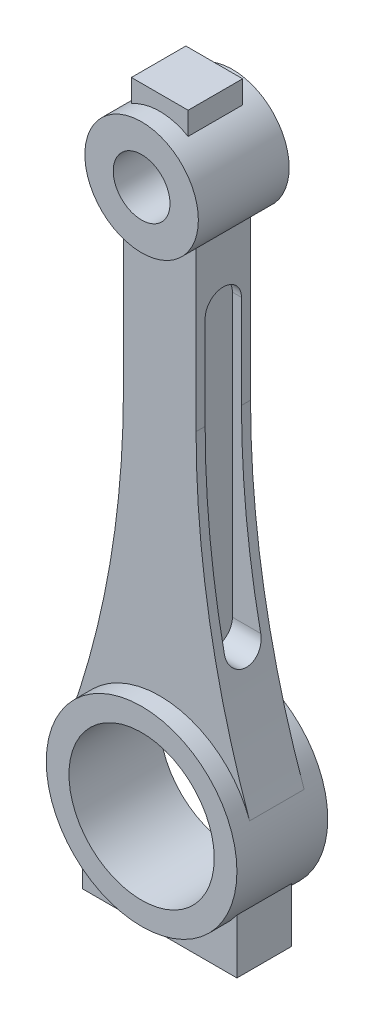
ISO-10303-21;
HEADER;
FILE_DESCRIPTION(('STEP AP214'),'2;1');
FILE_NAME('part.step','',(''),(''),'','','');
FILE_SCHEMA(('AUTOMOTIVE_DESIGN { 1 0 10303 214 1 1 1 1 }'));
ENDSEC;
DATA;
#1=APPLICATION_CONTEXT('core data for automotive mechanical design processes');
#2=APPLICATION_PROTOCOL_DEFINITION('international standard','automotive_design',2000,#1);
#3=PRODUCT_CONTEXT('',#1,'mechanical');
#4=PRODUCT('Part','Part','',(#3));
#5=PRODUCT_RELATED_PRODUCT_CATEGORY('part','',(#4));
#6=PRODUCT_DEFINITION_FORMATION('','',#4);
#7=PRODUCT_DEFINITION_CONTEXT('part definition',#1,'design');
#8=PRODUCT_DEFINITION('design','',#6,#7);
#9=PRODUCT_DEFINITION_SHAPE('','',#8);
#10=(LENGTH_UNIT() NAMED_UNIT(*) SI_UNIT(.MILLI.,.METRE.));
#11=(NAMED_UNIT(*) PLANE_ANGLE_UNIT() SI_UNIT($,.RADIAN.));
#12=(NAMED_UNIT(*) SI_UNIT($,.STERADIAN.) SOLID_ANGLE_UNIT());
#13=UNCERTAINTY_MEASURE_WITH_UNIT(LENGTH_MEASURE(1.E-05),#10,'distance_accuracy_value','');
#14=(GEOMETRIC_REPRESENTATION_CONTEXT(3) GLOBAL_UNCERTAINTY_ASSIGNED_CONTEXT((#13)) GLOBAL_UNIT_ASSIGNED_CONTEXT((#10,
#11,#12)) REPRESENTATION_CONTEXT('',''));
#15=CARTESIAN_POINT('',(0.,0.,0.));
#16=DIRECTION('',(0.,0.,1.));
#17=DIRECTION('',(1.,0.,0.));
#18=AXIS2_PLACEMENT_3D('',#15,#16,#17);
#19=CARTESIAN_POINT('',(212.132819979024,75.3953136438507,6.));
#20=DIRECTION('',(0.,0.,-1.));
#21=DIRECTION('',(-1.,0.,0.));
#22=AXIS2_PLACEMENT_3D('',#19,#20,#21);
#23=CYLINDRICAL_SURFACE('',#22,204.132819979024);
#24=CARTESIAN_POINT('',(212.132819979024,75.3953136438507,4.));
#25=DIRECTION('',(0.,0.,-1.));
#26=DIRECTION('',(0.,1.,0.));
#27=AXIS2_PLACEMENT_3D('',#24,#25,#26);
#28=CIRCLE('',#27,204.132819979024);
#29=CARTESIAN_POINT('',(7.99999999999999,75.3953136438507,4.));
#30=VERTEX_POINT('',#29);
#31=CARTESIAN_POINT('',(12.2412588742194,34.,3.99999999999999));
#32=VERTEX_POINT('',#31);
#33=EDGE_CURVE('E256',#30,#32,#28,.F.);
#34=ORIENTED_EDGE('',*,*,#33,.F.);
#35=DIRECTION('',(0.,0.,-1.));
#36=VECTOR('',#35,1.);
#37=CARTESIAN_POINT('',(7.99999999999999,75.3953136438507,6.));
#38=LINE('',#37,#36);
#39=CARTESIAN_POINT('',(7.99999999999999,75.3953136438507,6.));
#40=VERTEX_POINT('',#39);
#41=EDGE_CURVE('E380',#40,#30,#38,.T.);
#42=ORIENTED_EDGE('',*,*,#41,.F.);
#43=CARTESIAN_POINT('',(212.132819979024,75.3953136438507,6.));
#44=DIRECTION('',(0.,0.,-1.));
#45=DIRECTION('',(1.,0.,0.));
#46=AXIS2_PLACEMENT_3D('',#43,#44,#45);
#47=CIRCLE('',#46,204.132819979024);
#48=CARTESIAN_POINT('',(19.7873824881444,7.03274443356763,6.));
#49=VERTEX_POINT('',#48);
#50=EDGE_CURVE('E334',#49,#40,#47,.T.);
#51=ORIENTED_EDGE('',*,*,#50,.F.);
#52=DIRECTION('',(0.,0.,-1.));
#53=VECTOR('',#52,1.);
#54=CARTESIAN_POINT('',(19.7873824881444,7.03274443356764,6.));
#55=LINE('',#54,#53);
#56=CARTESIAN_POINT('',(19.7873824881444,7.03274443356764,-6.));
#57=VERTEX_POINT('',#56);
#58=EDGE_CURVE('E350',#49,#57,#55,.T.);
#59=ORIENTED_EDGE('',*,*,#58,.T.);
#60=CARTESIAN_POINT('',(212.132819979024,75.3953136438507,-6.));
#61=DIRECTION('',(0.,0.,-1.));
#62=DIRECTION('',(1.,0.,0.));
#63=AXIS2_PLACEMENT_3D('',#60,#61,#62);
#64=CIRCLE('',#63,204.132819979024);
#65=CARTESIAN_POINT('',(7.99999999999999,75.3953136438507,-6.));
#66=VERTEX_POINT('',#65);
#67=EDGE_CURVE('E331',#57,#66,#64,.T.);
#68=ORIENTED_EDGE('',*,*,#67,.T.);
#69=CARTESIAN_POINT('',(7.99999999999999,75.3953136438507,-4.));
#70=VERTEX_POINT('',#69);
#71=EDGE_CURVE('E379',#70,#66,#38,.T.);
#72=ORIENTED_EDGE('',*,*,#71,.F.);
#73=CARTESIAN_POINT('',(212.132819979024,75.3953136438507,-4.));
#74=DIRECTION('',(0.,0.,1.));
#75=DIRECTION('',(0.,-1.,0.));
#76=AXIS2_PLACEMENT_3D('',#73,#74,#75);
#77=CIRCLE('',#76,204.132819979024);
#78=CARTESIAN_POINT('',(12.2412588742194,34.,-4.00000000000001));
#79=VERTEX_POINT('',#78);
#80=EDGE_CURVE('E61',#79,#70,#77,.F.);
#81=ORIENTED_EDGE('',*,*,#80,.F.);
#82=CARTESIAN_POINT('',(12.2412588742194,34.,3.99999999999999));
#83=CARTESIAN_POINT('',(12.2649821362199,33.885439258088,4.00000940944051));
#84=CARTESIAN_POINT('',(12.2888046638883,33.7709046055161,3.99507842255405));
#85=CARTESIAN_POINT('',(12.3364753363724,33.5426871384525,3.97541991236472));
#86=CARTESIAN_POINT('',(12.3603234805685,33.4290043038652,3.96069262091166));
#87=CARTESIAN_POINT('',(12.4078699059457,33.2033022226647,3.92152880224722));
#88=CARTESIAN_POINT('',(12.4315682099026,33.0912827195546,3.89709378850664));
#89=CARTESIAN_POINT('',(12.4786318956205,32.869718666872,3.83869865010665));
#90=CARTESIAN_POINT('',(12.5019972823165,32.7601740805987,3.8047386667946));
#91=CARTESIAN_POINT('',(12.5713537566492,32.4362875071708,3.68880594202306));
#92=CARTESIAN_POINT('',(12.616619496317,32.2266247238004,3.59276859004084));
#93=CARTESIAN_POINT('',(12.7036113289944,31.8265060449701,3.36583926158574));
#94=CARTESIAN_POINT('',(12.7453385553655,31.6360439959286,3.23495850123743));
#95=CARTESIAN_POINT('',(12.8235261286531,31.2812986242281,2.9429536094608));
#96=CARTESIAN_POINT('',(12.8600266967268,31.1168142552535,2.7820851330218));
#97=CARTESIAN_POINT('',(12.9268129762671,30.8173079596086,2.43376826749078));
#98=CARTESIAN_POINT('',(12.9570984014148,30.6822873902572,2.24631865453249));
#99=CARTESIAN_POINT('',(13.0096793238884,30.4487106382991,1.85451503522365));
#100=CARTESIAN_POINT('',(13.0321342007067,30.3494255701813,1.65061709492081));
#101=CARTESIAN_POINT('',(13.0690509930666,30.1865634282783,1.2283653255167));
#102=CARTESIAN_POINT('',(13.0835145550311,30.1229789991708,1.0100144844849));
#103=CARTESIAN_POINT('',(13.103621225522,30.0346670814314,0.570336951516087));
#104=CARTESIAN_POINT('',(13.1094556610922,30.0090966684257,0.349188052657901));
#105=CARTESIAN_POINT('',(13.1126791652582,29.994963369769,-0.0943466737845338));
#106=CARTESIAN_POINT('',(13.1100687603628,30.0063981769605,-0.316732423392101));
#107=CARTESIAN_POINT('',(13.096586025507,30.0655590656487,-0.753848647278599));
#108=CARTESIAN_POINT('',(13.0858050796967,30.1128837376103,-0.968636482936994));
#109=CARTESIAN_POINT('',(13.0565163759981,30.2418212896254,-1.38709371798359));
#110=CARTESIAN_POINT('',(13.0380085166862,30.3234346197526,-1.59076297138939));
#111=CARTESIAN_POINT('',(12.9938291197407,30.5190328279759,-1.98271289758416));
#112=CARTESIAN_POINT('',(12.9681121028162,30.6332233041475,-2.17088572759695));
#113=CARTESIAN_POINT('',(12.9105110360879,30.8902902161515,-2.52540247470934));
#114=CARTESIAN_POINT('',(12.8786267416461,31.0331677899267,-2.69174552544512));
#115=CARTESIAN_POINT('',(12.8091062137375,31.3465731346848,-3.00147032619261));
#116=CARTESIAN_POINT('',(12.7713682855221,31.5175938662862,-3.1443302116827));
#117=CARTESIAN_POINT('',(12.6918719716954,31.8803634589365,-3.39946098518563));
#118=CARTESIAN_POINT('',(12.6501118301893,32.0721213773173,-3.51171843106335));
#119=CARTESIAN_POINT('',(12.5628790389922,32.475732019537,-3.70511692919111));
#120=CARTESIAN_POINT('',(12.5173419222061,32.6879528811881,-3.78545879426876));
#121=CARTESIAN_POINT('',(12.4248773720756,33.1224503523578,-3.90906304412675));
#122=CARTESIAN_POINT('',(12.377952003128,33.3447122665309,-3.95237787918078));
#123=CARTESIAN_POINT('',(12.3160501201013,33.6404084357623,-3.98445960469684));
#124=CARTESIAN_POINT('',(12.3010488803662,33.7122609728549,-3.99029001589252));
#125=CARTESIAN_POINT('',(12.2711071581171,33.8560635187012,-3.99805501413088));
#126=CARTESIAN_POINT('',(12.2561666159895,33.9280131647293,-3.99999608586507));
#127=CARTESIAN_POINT('',(12.2412588742194,34.,-4.00000000000001));
#128=B_SPLINE_CURVE_WITH_KNOTS('',3,(#82,#83,#84,#85,#86,#87,#88,#89,#90,#91,#92,#93,#94,#95,
#96,#97,#98,#99,#100,#101,#102,#103,#104,#105,#106,#107,#108,#109,#110,#111,#112,#113,#114,#115,
#116,#117,#118,#119,#120,#121,#122,#123,#124,#125,#126,#127),.UNSPECIFIED.,.F.,.F.,(4,2,2,2,2,2,
2,2,2,2,2,2,2,2,2,2,2,2,2,2,2,2,4),(0.,0.350860223201413,0.701712142865437,1.05250938483382,
1.40330142136449,2.10467672158739,2.80582652089027,3.50125159648831,4.19670870171066,
4.877047383472,5.55724584510181,6.22212410296728,6.88696090858965,7.54446955622533,
8.2019868346038,8.86374923349392,9.52553788797385,10.2004751288872,10.8757083603322,
11.566920058132,12.2571509966003,12.4779771448628,12.6984348025321),.UNSPECIFIED.);
#129=EDGE_CURVE('E401',#32,#79,#128,.T.);
#130=ORIENTED_EDGE('',*,*,#129,.F.);
#131=EDGE_LOOP('',(#34,#42,#51,#59,#68,#72,#81,#130));
#132=FACE_BOUND('',#131,.T.);
#133=ADVANCED_FACE('F38',(#132),#23,.F.);
#134=CARTESIAN_POINT('',(8.,110.395313643851,6.));
#135=DIRECTION('',(-1.,0.,0.));
#136=DIRECTION('',(0.,-1.,0.));
#137=AXIS2_PLACEMENT_3D('',#134,#135,#136);
#138=PLANE('',#137);
#139=DIRECTION('',(0.,-1.,0.));
#140=VECTOR('',#139,1.);
#141=CARTESIAN_POINT('',(8.,110.395313643851,4.));
#142=LINE('',#141,#140);
#143=CARTESIAN_POINT('',(7.99999999999999,96.,4.));
#144=VERTEX_POINT('',#143);
#145=EDGE_CURVE('E399',#144,#30,#142,.T.);
#146=ORIENTED_EDGE('',*,*,#145,.F.);
#147=CARTESIAN_POINT('',(7.99999999999999,96.,0.));
#148=DIRECTION('',(-1.,0.,0.));
#149=DIRECTION('',(0.,-1.,0.));
#150=AXIS2_PLACEMENT_3D('',#147,#148,#149);
#151=CIRCLE('',#150,4.);
#152=CARTESIAN_POINT('',(7.99999999999999,96.,-4.));
#153=VERTEX_POINT('',#152);
#154=EDGE_CURVE('E397',#153,#144,#151,.F.);
#155=ORIENTED_EDGE('',*,*,#154,.F.);
#156=DIRECTION('',(0.,1.,0.));
#157=VECTOR('',#156,1.);
#158=CARTESIAN_POINT('',(8.,110.395313643851,-4.));
#159=LINE('',#158,#157);
#160=EDGE_CURVE('E393',#70,#153,#159,.T.);
#161=ORIENTED_EDGE('',*,*,#160,.F.);
#162=ORIENTED_EDGE('',*,*,#71,.T.);
#163=DIRECTION('',(0.,1.,0.));
#164=VECTOR('',#163,1.);
#165=CARTESIAN_POINT('',(8.,110.395313643851,-6.));
#166=LINE('',#165,#164);
#167=CARTESIAN_POINT('',(8.,110.395313643851,-6.));
#168=VERTEX_POINT('',#167);
#169=EDGE_CURVE('E353',#66,#168,#166,.T.);
#170=ORIENTED_EDGE('',*,*,#169,.T.);
#171=DIRECTION('',(0.,0.,-1.));
#172=VECTOR('',#171,1.);
#173=CARTESIAN_POINT('',(8.,110.395313643851,6.));
#174=LINE('',#173,#172);
#175=CARTESIAN_POINT('',(8.,110.395313643851,6.));
#176=VERTEX_POINT('',#175);
#177=EDGE_CURVE('E376',#176,#168,#174,.T.);
#178=ORIENTED_EDGE('',*,*,#177,.F.);
#179=DIRECTION('',(0.,1.,0.));
#180=VECTOR('',#179,1.);
#181=CARTESIAN_POINT('',(8.,110.395313643851,6.));
#182=LINE('',#181,#180);
#183=EDGE_CURVE('E337',#40,#176,#182,.T.);
#184=ORIENTED_EDGE('',*,*,#183,.F.);
#185=ORIENTED_EDGE('',*,*,#41,.T.);
#186=EDGE_LOOP('',(#146,#155,#161,#162,#170,#178,#184,#185));
#187=FACE_BOUND('',#186,.T.);
#188=ADVANCED_FACE('F525',(#187),#138,.F.);
#189=CARTESIAN_POINT('',(0.,0.,10.));
#190=DIRECTION('',(0.,0.,1.));
#191=DIRECTION('',(1.,0.,0.));
#192=AXIS2_PLACEMENT_3D('',#189,#190,#191);
#193=PLANE('',#192);
#194=CARTESIAN_POINT('',(0.,0.,10.));
#195=DIRECTION('',(0.,0.,1.));
#196=DIRECTION('',(1.,0.,0.));
#197=AXIS2_PLACEMENT_3D('',#194,#195,#196);
#198=CIRCLE('',#197,21.);
#199=CARTESIAN_POINT('',(21.,0.,10.));
#200=VERTEX_POINT('',#199);
#201=EDGE_CURVE('E390',#200,#200,#198,.T.);
#202=ORIENTED_EDGE('',*,*,#201,.T.);
#203=EDGE_LOOP('',(#202));
#204=FACE_BOUND('',#203,.T.);
#205=CARTESIAN_POINT('',(0.,0.,10.));
#206=DIRECTION('',(0.,0.,1.));
#207=DIRECTION('',(1.,0.,0.));
#208=AXIS2_PLACEMENT_3D('',#205,#206,#207);
#209=CIRCLE('',#208,16.);
#210=CARTESIAN_POINT('',(16.,0.,10.));
#211=VERTEX_POINT('',#210);
#212=EDGE_CURVE('E384',#211,#211,#209,.T.);
#213=ORIENTED_EDGE('',*,*,#212,.F.);
#214=EDGE_LOOP('',(#213));
#215=FACE_BOUND('',#214,.T.);
#216=ADVANCED_FACE('F530',(#204,#215),#193,.T.);
#217=CARTESIAN_POINT('',(0.,0.,-10.));
#218=DIRECTION('',(0.,0.,1.));
#219=DIRECTION('',(1.,0.,0.));
#220=AXIS2_PLACEMENT_3D('',#217,#218,#219);
#221=PLANE('',#220);
#222=CARTESIAN_POINT('',(0.,0.,-10.));
#223=DIRECTION('',(0.,0.,1.));
#224=DIRECTION('',(1.,0.,0.));
#225=AXIS2_PLACEMENT_3D('',#222,#223,#224);
#226=CIRCLE('',#225,21.);
#227=CARTESIAN_POINT('',(21.,0.,-10.));
#228=VERTEX_POINT('',#227);
#229=EDGE_CURVE('E387',#228,#228,#226,.T.);
#230=ORIENTED_EDGE('',*,*,#229,.F.);
#231=EDGE_LOOP('',(#230));
#232=FACE_BOUND('',#231,.T.);
#233=CARTESIAN_POINT('',(0.,0.,-10.));
#234=DIRECTION('',(0.,0.,1.));
#235=DIRECTION('',(1.,0.,0.));
#236=AXIS2_PLACEMENT_3D('',#233,#234,#235);
#237=CIRCLE('',#236,16.);
#238=CARTESIAN_POINT('',(16.,0.,-10.));
#239=VERTEX_POINT('',#238);
#240=EDGE_CURVE('E383',#239,#239,#237,.T.);
#241=ORIENTED_EDGE('',*,*,#240,.T.);
#242=EDGE_LOOP('',(#241));
#243=FACE_BOUND('',#242,.T.);
#244=ADVANCED_FACE('F567',(#232,#243),#221,.F.);
#245=CARTESIAN_POINT('',(0.,0.,10.));
#246=DIRECTION('',(0.,0.,-1.));
#247=DIRECTION('',(-1.,0.,0.));
#248=AXIS2_PLACEMENT_3D('',#245,#246,#247);
#249=CYLINDRICAL_SURFACE('',#248,21.);
#250=DIRECTION('',(0.,0.,-1.));
#251=VECTOR('',#250,1.);
#252=CARTESIAN_POINT('',(-17.,-12.328828005938,6.));
#253=LINE('',#252,#251);
#254=CARTESIAN_POINT('',(-17.,-12.328828005938,6.));
#255=VERTEX_POINT('',#254);
#256=CARTESIAN_POINT('',(-17.,-12.328828005938,-6.));
#257=VERTEX_POINT('',#256);
#258=EDGE_CURVE('E259',#255,#257,#253,.T.);
#259=ORIENTED_EDGE('',*,*,#258,.F.);
#260=CARTESIAN_POINT('',(0.,0.,6.));
#261=DIRECTION('',(0.,0.,1.));
#262=DIRECTION('',(1.,0.,0.));
#263=AXIS2_PLACEMENT_3D('',#260,#261,#262);
#264=CIRCLE('',#263,21.);
#265=CARTESIAN_POINT('',(17.,-12.3288280059379,6.));
#266=VERTEX_POINT('',#265);
#267=EDGE_CURVE('E286',#255,#266,#264,.T.);
#268=ORIENTED_EDGE('',*,*,#267,.T.);
#269=DIRECTION('',(0.,0.,-1.));
#270=VECTOR('',#269,1.);
#271=CARTESIAN_POINT('',(17.,-12.328828005938,6.));
#272=LINE('',#271,#270);
#273=CARTESIAN_POINT('',(17.,-12.328828005938,-6.));
#274=VERTEX_POINT('',#273);
#275=EDGE_CURVE('E263',#266,#274,#272,.T.);
#276=ORIENTED_EDGE('',*,*,#275,.T.);
#277=CARTESIAN_POINT('',(0.,0.,-6.));
#278=DIRECTION('',(0.,0.,1.));
#279=DIRECTION('',(1.,0.,0.));
#280=AXIS2_PLACEMENT_3D('',#277,#278,#279);
#281=CIRCLE('',#280,21.);
#282=EDGE_CURVE('E275',#257,#274,#281,.T.);
#283=ORIENTED_EDGE('',*,*,#282,.F.);
#284=EDGE_LOOP('',(#259,#268,#276,#283));
#285=FACE_BOUND('',#284,.T.);
#286=ORIENTED_EDGE('',*,*,#58,.F.);
#287=CARTESIAN_POINT('',(0.,0.,6.));
#288=DIRECTION('',(0.,0.,-1.));
#289=DIRECTION('',(1.,0.,0.));
#290=AXIS2_PLACEMENT_3D('',#287,#288,#289);
#291=CIRCLE('',#290,21.);
#292=CARTESIAN_POINT('',(-19.7873824881444,7.03274443356763,6.));
#293=VERTEX_POINT('',#292);
#294=EDGE_CURVE('E347',#293,#49,#291,.T.);
#295=ORIENTED_EDGE('',*,*,#294,.F.);
#296=DIRECTION('',(0.,0.,-1.));
#297=VECTOR('',#296,1.);
#298=CARTESIAN_POINT('',(-19.7873824881444,7.03274443356766,6.));
#299=LINE('',#298,#297);
#300=CARTESIAN_POINT('',(-19.7873824881444,7.03274443356766,-6.));
#301=VERTEX_POINT('',#300);
#302=EDGE_CURVE('E367',#293,#301,#299,.T.);
#303=ORIENTED_EDGE('',*,*,#302,.T.);
#304=CARTESIAN_POINT('',(0.,0.,-6.));
#305=DIRECTION('',(0.,0.,-1.));
#306=DIRECTION('',(1.,0.,0.));
#307=AXIS2_PLACEMENT_3D('',#304,#305,#306);
#308=CIRCLE('',#307,21.);
#309=EDGE_CURVE('E338',#301,#57,#308,.T.);
#310=ORIENTED_EDGE('',*,*,#309,.T.);
#311=EDGE_LOOP('',(#286,#295,#303,#310));
#312=FACE_BOUND('',#311,.T.);
#313=ORIENTED_EDGE('',*,*,#201,.F.);
#314=EDGE_LOOP('',(#313));
#315=FACE_BOUND('',#314,.T.);
#316=ORIENTED_EDGE('',*,*,#229,.T.);
#317=EDGE_LOOP('',(#316));
#318=FACE_BOUND('',#317,.T.);
#319=ADVANCED_FACE('F40',(#285,#312,#315,#318),#249,.T.);
#320=CARTESIAN_POINT('',(0.,0.,10.));
#321=DIRECTION('',(0.,0.,-1.));
#322=DIRECTION('',(-1.,0.,0.));
#323=AXIS2_PLACEMENT_3D('',#320,#321,#322);
#324=CYLINDRICAL_SURFACE('',#323,16.);
#325=ORIENTED_EDGE('',*,*,#212,.T.);
#326=EDGE_LOOP('',(#325));
#327=FACE_BOUND('',#326,.T.);
#328=ORIENTED_EDGE('',*,*,#240,.F.);
#329=EDGE_LOOP('',(#328));
#330=FACE_BOUND('',#329,.T.);
#331=ADVANCED_FACE('F566',(#327,#330),#324,.F.);
#332=CARTESIAN_POINT('',(-8.,110.395313643851,6.));
#333=DIRECTION('',(1.,0.,0.));
#334=DIRECTION('',(0.,1.,0.));
#335=AXIS2_PLACEMENT_3D('',#332,#333,#334);
#336=PLANE('',#335);
#337=DIRECTION('',(0.,0.,-1.));
#338=VECTOR('',#337,1.);
#339=CARTESIAN_POINT('',(-7.99999999999999,75.3953136438507,6.));
#340=LINE('',#339,#338);
#341=CARTESIAN_POINT('',(-8.00000000000001,75.3953136438507,-4.));
#342=VERTEX_POINT('',#341);
#343=CARTESIAN_POINT('',(-7.99999999999999,75.3953136438507,-6.));
#344=VERTEX_POINT('',#343);
#345=EDGE_CURVE('E369',#342,#344,#340,.T.);
#346=ORIENTED_EDGE('',*,*,#345,.F.);
#347=DIRECTION('',(0.,1.,0.));
#348=VECTOR('',#347,1.);
#349=CARTESIAN_POINT('',(-8.,110.395313643851,-4.));
#350=LINE('',#349,#348);
#351=CARTESIAN_POINT('',(-7.99999999999999,96.,-4.));
#352=VERTEX_POINT('',#351);
#353=EDGE_CURVE('E233',#342,#352,#350,.T.);
#354=ORIENTED_EDGE('',*,*,#353,.T.);
#355=CARTESIAN_POINT('',(-7.99999999999999,96.,0.));
#356=DIRECTION('',(1.,0.,0.));
#357=DIRECTION('',(0.,1.,0.));
#358=AXIS2_PLACEMENT_3D('',#355,#356,#357);
#359=CIRCLE('',#358,4.);
#360=CARTESIAN_POINT('',(-7.99999999999999,96.,4.));
#361=VERTEX_POINT('',#360);
#362=EDGE_CURVE('E11',#352,#361,#359,.T.);
#363=ORIENTED_EDGE('',*,*,#362,.T.);
#364=DIRECTION('',(0.,-1.,0.));
#365=VECTOR('',#364,1.);
#366=CARTESIAN_POINT('',(-8.,110.395313643851,4.));
#367=LINE('',#366,#365);
#368=CARTESIAN_POINT('',(-8.00000000000001,75.3953136438507,4.));
#369=VERTEX_POINT('',#368);
#370=EDGE_CURVE('E209',#361,#369,#367,.T.);
#371=ORIENTED_EDGE('',*,*,#370,.T.);
#372=CARTESIAN_POINT('',(-7.99999999999999,75.3953136438507,6.));
#373=VERTEX_POINT('',#372);
#374=EDGE_CURVE('E370',#373,#369,#340,.T.);
#375=ORIENTED_EDGE('',*,*,#374,.F.);
#376=DIRECTION('',(0.,-1.,0.));
#377=VECTOR('',#376,1.);
#378=CARTESIAN_POINT('',(-8.,110.395313643851,6.));
#379=LINE('',#378,#377);
#380=CARTESIAN_POINT('',(-8.,110.395313643851,6.));
#381=VERTEX_POINT('',#380);
#382=EDGE_CURVE('E342',#381,#373,#379,.T.);
#383=ORIENTED_EDGE('',*,*,#382,.F.);
#384=DIRECTION('',(0.,0.,-1.));
#385=VECTOR('',#384,1.);
#386=CARTESIAN_POINT('',(-8.,110.395313643851,6.));
#387=LINE('',#386,#385);
#388=CARTESIAN_POINT('',(-8.,110.395313643851,-6.));
#389=VERTEX_POINT('',#388);
#390=EDGE_CURVE('E373',#381,#389,#387,.T.);
#391=ORIENTED_EDGE('',*,*,#390,.T.);
#392=DIRECTION('',(0.,-1.,0.));
#393=VECTOR('',#392,1.);
#394=CARTESIAN_POINT('',(-8.,110.395313643851,-6.));
#395=LINE('',#394,#393);
#396=EDGE_CURVE('E358',#389,#344,#395,.T.);
#397=ORIENTED_EDGE('',*,*,#396,.T.);
#398=EDGE_LOOP('',(#346,#354,#363,#371,#375,#383,#391,#397));
#399=FACE_BOUND('',#398,.T.);
#400=ADVANCED_FACE('F498',(#399),#336,.F.);
#401=CARTESIAN_POINT('',(-212.132819979024,75.3953136438507,6.));
#402=DIRECTION('',(0.,0.,-1.));
#403=DIRECTION('',(-1.,0.,0.));
#404=AXIS2_PLACEMENT_3D('',#401,#402,#403);
#405=CYLINDRICAL_SURFACE('',#404,204.132819979024);
#406=CARTESIAN_POINT('',(-12.2412588742194,34.,3.99999999999999));
#407=CARTESIAN_POINT('',(-12.2649821362199,33.885439258088,4.00000940944051));
#408=CARTESIAN_POINT('',(-12.2888046638883,33.7709046055161,3.99507842255405));
#409=CARTESIAN_POINT('',(-12.3364753363724,33.5426871384525,3.97541991236472));
#410=CARTESIAN_POINT('',(-12.3603234805685,33.4290043038652,3.96069262091166));
#411=CARTESIAN_POINT('',(-12.4078699059457,33.2033022226647,3.92152880224722));
#412=CARTESIAN_POINT('',(-12.4315682099026,33.0912827195546,3.89709378850664));
#413=CARTESIAN_POINT('',(-12.4786318956205,32.869718666872,3.83869865010665));
#414=CARTESIAN_POINT('',(-12.5019972823165,32.7601740805987,3.8047386667946));
#415=CARTESIAN_POINT('',(-12.5713537566492,32.4362875071708,3.68880594202306));
#416=CARTESIAN_POINT('',(-12.616619496317,32.2266247238004,3.59276859004084));
#417=CARTESIAN_POINT('',(-12.7036113289944,31.8265060449701,3.36583926158574));
#418=CARTESIAN_POINT('',(-12.7453385553655,31.6360439959286,3.23495850123743));
#419=CARTESIAN_POINT('',(-12.8235261286531,31.2812986242281,2.9429536094608));
#420=CARTESIAN_POINT('',(-12.8600266967268,31.1168142552535,2.7820851330218));
#421=CARTESIAN_POINT('',(-12.9268129762671,30.8173079596086,2.43376826749078));
#422=CARTESIAN_POINT('',(-12.9570984014148,30.6822873902572,2.24631865453249));
#423=CARTESIAN_POINT('',(-13.0096793238884,30.4487106382991,1.85451503522365));
#424=CARTESIAN_POINT('',(-13.0321342007067,30.3494255701813,1.65061709492081));
#425=CARTESIAN_POINT('',(-13.0690509930666,30.1865634282783,1.2283653255167));
#426=CARTESIAN_POINT('',(-13.0835145550311,30.1229789991708,1.0100144844849));
#427=CARTESIAN_POINT('',(-13.103621225522,30.0346670814314,0.570336951516087));
#428=CARTESIAN_POINT('',(-13.1094556610922,30.0090966684257,0.349188052657901));
#429=CARTESIAN_POINT('',(-13.1126791652582,29.994963369769,-0.0943466737845338));
#430=CARTESIAN_POINT('',(-13.1100687603628,30.0063981769605,-0.316732423392101));
#431=CARTESIAN_POINT('',(-13.096586025507,30.0655590656487,-0.753848647278599));
#432=CARTESIAN_POINT('',(-13.0858050796967,30.1128837376103,-0.968636482936994));
#433=CARTESIAN_POINT('',(-13.0565163759981,30.2418212896254,-1.38709371798359));
#434=CARTESIAN_POINT('',(-13.0380085166862,30.3234346197526,-1.59076297138939));
#435=CARTESIAN_POINT('',(-12.9938291197407,30.5190328279759,-1.98271289758416));
#436=CARTESIAN_POINT('',(-12.9681121028162,30.6332233041475,-2.17088572759695));
#437=CARTESIAN_POINT('',(-12.9105110360879,30.8902902161515,-2.52540247470934));
#438=CARTESIAN_POINT('',(-12.8786267416461,31.0331677899267,-2.69174552544512));
#439=CARTESIAN_POINT('',(-12.8091062137375,31.3465731346848,-3.00147032619261));
#440=CARTESIAN_POINT('',(-12.7713682855221,31.5175938662862,-3.1443302116827));
#441=CARTESIAN_POINT('',(-12.6918719716954,31.8803634589365,-3.39946098518563));
#442=CARTESIAN_POINT('',(-12.6501118301893,32.0721213773173,-3.51171843106335));
#443=CARTESIAN_POINT('',(-12.5628790389922,32.475732019537,-3.70511692919111));
#444=CARTESIAN_POINT('',(-12.5173419222061,32.6879528811881,-3.78545879426876));
#445=CARTESIAN_POINT('',(-12.4248773720756,33.1224503523578,-3.90906304412675));
#446=CARTESIAN_POINT('',(-12.377952003128,33.3447122665309,-3.95237787918078));
#447=CARTESIAN_POINT('',(-12.3160501201013,33.6404084357623,-3.98445960469684));
#448=CARTESIAN_POINT('',(-12.3010488803662,33.7122609728549,-3.99029001589252));
#449=CARTESIAN_POINT('',(-12.2711071581171,33.8560635187012,-3.99805501413088));
#450=CARTESIAN_POINT('',(-12.2561666159895,33.9280131647293,-3.99999608586507));
#451=CARTESIAN_POINT('',(-12.2412588742194,34.,-4.00000000000001));
#452=B_SPLINE_CURVE_WITH_KNOTS('',3,(#406,#407,#408,#409,#410,#411,#412,#413,#414,#415,#416,
#417,#418,#419,#420,#421,#422,#423,#424,#425,#426,#427,#428,#429,#430,#431,#432,#433,#434,#435,
#436,#437,#438,#439,#440,#441,#442,#443,#444,#445,#446,#447,#448,#449,#450,#451),.UNSPECIFIED.,
.F.,.F.,(4,2,2,2,2,2,2,2,2,2,2,2,2,2,2,2,2,2,2,2,2,2,4),(0.,0.350860223201413,0.701712142865437,
1.05250938483382,1.40330142136449,2.10467672158739,2.80582652089027,3.50125159648831,
4.19670870171066,4.877047383472,5.55724584510181,6.22212410296728,6.88696090858965,
7.54446955622533,8.2019868346038,8.86374923349392,9.52553788797385,10.2004751288872,
10.8757083603322,11.566920058132,12.2571509966003,12.4779771448628,12.6984348025321),.UNSPECIFIED.);
#453=CARTESIAN_POINT('',(-12.2412588742194,34.,3.99999999999999));
#454=VERTEX_POINT('',#453);
#455=CARTESIAN_POINT('',(-12.2412588742194,34.,-4.00000000000001));
#456=VERTEX_POINT('',#455);
#457=EDGE_CURVE('E500',#454,#456,#452,.T.);
#458=ORIENTED_EDGE('',*,*,#457,.T.);
#459=CARTESIAN_POINT('',(-212.132819979024,75.3953136438507,-4.));
#460=DIRECTION('',(0.,0.,-1.));
#461=DIRECTION('',(0.,1.,0.));
#462=AXIS2_PLACEMENT_3D('',#459,#460,#461);
#463=CIRCLE('',#462,204.132819979024);
#464=EDGE_CURVE('E46',#456,#342,#463,.F.);
#465=ORIENTED_EDGE('',*,*,#464,.T.);
#466=ORIENTED_EDGE('',*,*,#345,.T.);
#467=CARTESIAN_POINT('',(-212.132819979024,75.3953136438507,-6.));
#468=DIRECTION('',(0.,0.,-1.));
#469=DIRECTION('',(-1.,0.,0.));
#470=AXIS2_PLACEMENT_3D('',#467,#468,#469);
#471=CIRCLE('',#470,204.132819979024);
#472=EDGE_CURVE('E361',#344,#301,#471,.T.);
#473=ORIENTED_EDGE('',*,*,#472,.T.);
#474=ORIENTED_EDGE('',*,*,#302,.F.);
#475=CARTESIAN_POINT('',(-212.132819979024,75.3953136438507,6.));
#476=DIRECTION('',(0.,0.,-1.));
#477=DIRECTION('',(-1.,0.,0.));
#478=AXIS2_PLACEMENT_3D('',#475,#476,#477);
#479=CIRCLE('',#478,204.132819979024);
#480=EDGE_CURVE('E344',#373,#293,#479,.T.);
#481=ORIENTED_EDGE('',*,*,#480,.F.);
#482=ORIENTED_EDGE('',*,*,#374,.T.);
#483=CARTESIAN_POINT('',(-212.132819979024,75.3953136438507,4.));
#484=DIRECTION('',(0.,0.,1.));
#485=DIRECTION('',(0.,-1.,0.));
#486=AXIS2_PLACEMENT_3D('',#483,#484,#485);
#487=CIRCLE('',#486,204.132819979024);
#488=EDGE_CURVE('E409',#369,#454,#487,.F.);
#489=ORIENTED_EDGE('',*,*,#488,.T.);
#490=EDGE_LOOP('',(#458,#465,#466,#473,#474,#481,#482,#489));
#491=FACE_BOUND('',#490,.T.);
#492=ADVANCED_FACE('F490',(#491),#405,.F.);
#493=CARTESIAN_POINT('',(212.132819979024,75.3953136438507,6.));
#494=DIRECTION('',(0.,0.,1.));
#495=DIRECTION('',(1.,0.,0.));
#496=AXIS2_PLACEMENT_3D('',#493,#494,#495);
#497=PLANE('',#496);
#498=ORIENTED_EDGE('',*,*,#50,.T.);
#499=ORIENTED_EDGE('',*,*,#183,.T.);
#500=CARTESIAN_POINT('',(0.,120.,6.));
#501=DIRECTION('',(0.,0.,-1.));
#502=DIRECTION('',(1.,0.,0.));
#503=AXIS2_PLACEMENT_3D('',#500,#501,#502);
#504=CIRCLE('',#503,12.5);
#505=EDGE_CURVE('E340',#176,#381,#504,.T.);
#506=ORIENTED_EDGE('',*,*,#505,.T.);
#507=ORIENTED_EDGE('',*,*,#382,.T.);
#508=ORIENTED_EDGE('',*,*,#480,.T.);
#509=ORIENTED_EDGE('',*,*,#294,.T.);
#510=EDGE_LOOP('',(#498,#499,#506,#507,#508,#509));
#511=FACE_BOUND('',#510,.T.);
#512=ADVANCED_FACE('F487',(#511),#497,.T.);
#513=CARTESIAN_POINT('',(212.132819979024,75.3953136438507,-6.));
#514=DIRECTION('',(0.,0.,1.));
#515=DIRECTION('',(1.,0.,0.));
#516=AXIS2_PLACEMENT_3D('',#513,#514,#515);
#517=PLANE('',#516);
#518=ORIENTED_EDGE('',*,*,#67,.F.);
#519=ORIENTED_EDGE('',*,*,#309,.F.);
#520=ORIENTED_EDGE('',*,*,#472,.F.);
#521=ORIENTED_EDGE('',*,*,#396,.F.);
#522=CARTESIAN_POINT('',(0.,120.,-6.));
#523=DIRECTION('',(0.,0.,-1.));
#524=DIRECTION('',(1.,0.,0.));
#525=AXIS2_PLACEMENT_3D('',#522,#523,#524);
#526=CIRCLE('',#525,12.5);
#527=EDGE_CURVE('E355',#168,#389,#526,.T.);
#528=ORIENTED_EDGE('',*,*,#527,.F.);
#529=ORIENTED_EDGE('',*,*,#169,.F.);
#530=EDGE_LOOP('',(#518,#519,#520,#521,#528,#529));
#531=FACE_BOUND('',#530,.T.);
#532=ADVANCED_FACE('F479',(#531),#517,.F.);
#533=CARTESIAN_POINT('',(0.,120.,10.));
#534=DIRECTION('',(0.,0.,1.));
#535=DIRECTION('',(1.,0.,0.));
#536=AXIS2_PLACEMENT_3D('',#533,#534,#535);
#537=PLANE('',#536);
#538=CARTESIAN_POINT('',(0.,120.,10.));
#539=DIRECTION('',(0.,0.,1.));
#540=DIRECTION('',(1.,0.,0.));
#541=AXIS2_PLACEMENT_3D('',#538,#539,#540);
#542=CIRCLE('',#541,12.5);
#543=CARTESIAN_POINT('',(12.5,120.,10.));
#544=VERTEX_POINT('',#543);
#545=EDGE_CURVE('E328',#544,#544,#542,.T.);
#546=ORIENTED_EDGE('',*,*,#545,.T.);
#547=EDGE_LOOP('',(#546));
#548=FACE_BOUND('',#547,.T.);
#549=CARTESIAN_POINT('',(0.,120.,10.));
#550=DIRECTION('',(0.,0.,1.));
#551=DIRECTION('',(1.,0.,0.));
#552=AXIS2_PLACEMENT_3D('',#549,#550,#551);
#553=CIRCLE('',#552,6.25);
#554=CARTESIAN_POINT('',(6.25,120.,10.));
#555=VERTEX_POINT('',#554);
#556=EDGE_CURVE('E322',#555,#555,#553,.T.);
#557=ORIENTED_EDGE('',*,*,#556,.F.);
#558=EDGE_LOOP('',(#557));
#559=FACE_BOUND('',#558,.T.);
#560=ADVANCED_FACE('F475',(#548,#559),#537,.T.);
#561=CARTESIAN_POINT('',(0.,120.,-10.));
#562=DIRECTION('',(0.,0.,1.));
#563=DIRECTION('',(1.,0.,0.));
#564=AXIS2_PLACEMENT_3D('',#561,#562,#563);
#565=PLANE('',#564);
#566=CARTESIAN_POINT('',(0.,120.,-10.));
#567=DIRECTION('',(0.,0.,1.));
#568=DIRECTION('',(1.,0.,0.));
#569=AXIS2_PLACEMENT_3D('',#566,#567,#568);
#570=CIRCLE('',#569,12.5);
#571=CARTESIAN_POINT('',(12.5,120.,-10.));
#572=VERTEX_POINT('',#571);
#573=EDGE_CURVE('E325',#572,#572,#570,.T.);
#574=ORIENTED_EDGE('',*,*,#573,.F.);
#575=EDGE_LOOP('',(#574));
#576=FACE_BOUND('',#575,.T.);
#577=CARTESIAN_POINT('',(0.,120.,-10.));
#578=DIRECTION('',(0.,0.,1.));
#579=DIRECTION('',(1.,0.,0.));
#580=AXIS2_PLACEMENT_3D('',#577,#578,#579);
#581=CIRCLE('',#580,6.25);
#582=CARTESIAN_POINT('',(6.25,120.,-10.));
#583=VERTEX_POINT('',#582);
#584=EDGE_CURVE('E321',#583,#583,#581,.T.);
#585=ORIENTED_EDGE('',*,*,#584,.T.);
#586=EDGE_LOOP('',(#585));
#587=FACE_BOUND('',#586,.T.);
#588=ADVANCED_FACE('F478',(#576,#587),#565,.F.);
#589=CARTESIAN_POINT('',(0.,120.,10.));
#590=DIRECTION('',(0.,0.,-1.));
#591=DIRECTION('',(-1.,0.,0.));
#592=AXIS2_PLACEMENT_3D('',#589,#590,#591);
#593=CYLINDRICAL_SURFACE('',#592,12.5);
#594=DIRECTION('',(0.,0.,-1.));
#595=VECTOR('',#594,1.);
#596=CARTESIAN_POINT('',(6.25000000000002,130.825317547305,6.));
#597=LINE('',#596,#595);
#598=CARTESIAN_POINT('',(6.25000000000002,130.825317547305,6.));
#599=VERTEX_POINT('',#598);
#600=CARTESIAN_POINT('',(6.25000000000001,130.825317547305,-6.));
#601=VERTEX_POINT('',#600);
#602=EDGE_CURVE('E318',#599,#601,#597,.T.);
#603=ORIENTED_EDGE('',*,*,#602,.F.);
#604=CARTESIAN_POINT('',(0.,120.,6.));
#605=DIRECTION('',(0.,0.,1.));
#606=DIRECTION('',(1.,0.,0.));
#607=AXIS2_PLACEMENT_3D('',#604,#605,#606);
#608=CIRCLE('',#607,12.5);
#609=CARTESIAN_POINT('',(-6.25000000000002,130.825317547305,6.));
#610=VERTEX_POINT('',#609);
#611=EDGE_CURVE('E290',#599,#610,#608,.T.);
#612=ORIENTED_EDGE('',*,*,#611,.T.);
#613=DIRECTION('',(0.,0.,-1.));
#614=VECTOR('',#613,1.);
#615=CARTESIAN_POINT('',(-6.25000000000002,130.825317547305,6.));
#616=LINE('',#615,#614);
#617=CARTESIAN_POINT('',(-6.25000000000002,130.825317547305,-6.));
#618=VERTEX_POINT('',#617);
#619=EDGE_CURVE('E302',#610,#618,#616,.T.);
#620=ORIENTED_EDGE('',*,*,#619,.T.);
#621=CARTESIAN_POINT('',(0.,120.,-6.));
#622=DIRECTION('',(0.,0.,1.));
#623=DIRECTION('',(1.,0.,0.));
#624=AXIS2_PLACEMENT_3D('',#621,#622,#623);
#625=CIRCLE('',#624,12.5);
#626=EDGE_CURVE('E281',#601,#618,#625,.T.);
#627=ORIENTED_EDGE('',*,*,#626,.F.);
#628=EDGE_LOOP('',(#603,#612,#620,#627));
#629=FACE_BOUND('',#628,.T.);
#630=ORIENTED_EDGE('',*,*,#505,.F.);
#631=ORIENTED_EDGE('',*,*,#177,.T.);
#632=ORIENTED_EDGE('',*,*,#527,.T.);
#633=ORIENTED_EDGE('',*,*,#390,.F.);
#634=EDGE_LOOP('',(#630,#631,#632,#633));
#635=FACE_BOUND('',#634,.T.);
#636=ORIENTED_EDGE('',*,*,#545,.F.);
#637=EDGE_LOOP('',(#636));
#638=FACE_BOUND('',#637,.T.);
#639=ORIENTED_EDGE('',*,*,#573,.T.);
#640=EDGE_LOOP('',(#639));
#641=FACE_BOUND('',#640,.T.);
#642=ADVANCED_FACE('F473',(#629,#635,#638,#641),#593,.T.);
#643=CARTESIAN_POINT('',(0.,120.,10.));
#644=DIRECTION('',(0.,0.,-1.));
#645=DIRECTION('',(-1.,0.,0.));
#646=AXIS2_PLACEMENT_3D('',#643,#644,#645);
#647=CYLINDRICAL_SURFACE('',#646,6.25);
#648=ORIENTED_EDGE('',*,*,#556,.T.);
#649=EDGE_LOOP('',(#648));
#650=FACE_BOUND('',#649,.T.);
#651=ORIENTED_EDGE('',*,*,#584,.F.);
#652=EDGE_LOOP('',(#651));
#653=FACE_BOUND('',#652,.T.);
#654=ADVANCED_FACE('F469',(#650,#653),#647,.F.);
#655=CARTESIAN_POINT('',(6.25000000000095,0.,6.));
#656=DIRECTION('',(1.,0.,0.));
#657=DIRECTION('',(0.,1.,0.));
#658=AXIS2_PLACEMENT_3D('',#655,#656,#657);
#659=PLANE('',#658);
#660=DIRECTION('',(0.,-1.,0.));
#661=VECTOR('',#660,1.);
#662=CARTESIAN_POINT('',(6.25000000000095,0.,-6.));
#663=LINE('',#662,#661);
#664=CARTESIAN_POINT('',(6.24999999999998,135.825317547305,-6.));
#665=VERTEX_POINT('',#664);
#666=EDGE_CURVE('E305',#665,#601,#663,.T.);
#667=ORIENTED_EDGE('',*,*,#666,.F.);
#668=DIRECTION('',(0.,0.,-1.));
#669=VECTOR('',#668,1.);
#670=CARTESIAN_POINT('',(6.24999999999998,135.825317547305,6.));
#671=LINE('',#670,#669);
#672=CARTESIAN_POINT('',(6.24999999999998,135.825317547305,6.));
#673=VERTEX_POINT('',#672);
#674=EDGE_CURVE('E316',#673,#665,#671,.T.);
#675=ORIENTED_EDGE('',*,*,#674,.F.);
#676=DIRECTION('',(0.,-1.,0.));
#677=VECTOR('',#676,1.);
#678=CARTESIAN_POINT('',(6.25000000000095,0.,6.));
#679=LINE('',#678,#677);
#680=EDGE_CURVE('E292',#673,#599,#679,.T.);
#681=ORIENTED_EDGE('',*,*,#680,.T.);
#682=ORIENTED_EDGE('',*,*,#602,.T.);
#683=EDGE_LOOP('',(#667,#675,#681,#682));
#684=FACE_BOUND('',#683,.T.);
#685=ADVANCED_FACE('F465',(#684),#659,.T.);
#686=CARTESIAN_POINT('',(0.,135.825317547305,6.));
#687=DIRECTION('',(0.,1.,0.));
#688=DIRECTION('',(0.,0.,1.));
#689=AXIS2_PLACEMENT_3D('',#686,#687,#688);
#690=PLANE('',#689);
#691=DIRECTION('',(1.,0.,0.));
#692=VECTOR('',#691,1.);
#693=CARTESIAN_POINT('',(0.,135.825317547305,-6.));
#694=LINE('',#693,#692);
#695=CARTESIAN_POINT('',(-6.25000000000002,135.825317547305,-6.));
#696=VERTEX_POINT('',#695);
#697=EDGE_CURVE('E308',#696,#665,#694,.T.);
#698=ORIENTED_EDGE('',*,*,#697,.F.);
#699=DIRECTION('',(0.,0.,-1.));
#700=VECTOR('',#699,1.);
#701=CARTESIAN_POINT('',(-6.25000000000002,135.825317547305,6.));
#702=LINE('',#701,#700);
#703=CARTESIAN_POINT('',(-6.25000000000002,135.825317547305,6.));
#704=VERTEX_POINT('',#703);
#705=EDGE_CURVE('E314',#704,#696,#702,.T.);
#706=ORIENTED_EDGE('',*,*,#705,.F.);
#707=DIRECTION('',(1.,0.,0.));
#708=VECTOR('',#707,1.);
#709=CARTESIAN_POINT('',(0.,135.825317547305,6.));
#710=LINE('',#709,#708);
#711=EDGE_CURVE('E296',#704,#673,#710,.T.);
#712=ORIENTED_EDGE('',*,*,#711,.T.);
#713=ORIENTED_EDGE('',*,*,#674,.T.);
#714=EDGE_LOOP('',(#698,#706,#712,#713));
#715=FACE_BOUND('',#714,.T.);
#716=ADVANCED_FACE('F461',(#715),#690,.T.);
#717=CARTESIAN_POINT('',(-6.25000000000004,0.,6.));
#718=DIRECTION('',(1.,0.,0.));
#719=DIRECTION('',(0.,1.,0.));
#720=AXIS2_PLACEMENT_3D('',#717,#718,#719);
#721=PLANE('',#720);
#722=DIRECTION('',(0.,-1.,0.));
#723=VECTOR('',#722,1.);
#724=CARTESIAN_POINT('',(-6.25000000000004,0.,-6.));
#725=LINE('',#724,#723);
#726=EDGE_CURVE('E293',#696,#618,#725,.T.);
#727=ORIENTED_EDGE('',*,*,#726,.T.);
#728=ORIENTED_EDGE('',*,*,#619,.F.);
#729=DIRECTION('',(0.,-1.,0.));
#730=VECTOR('',#729,1.);
#731=CARTESIAN_POINT('',(-6.25000000000004,0.,6.));
#732=LINE('',#731,#730);
#733=EDGE_CURVE('E299',#704,#610,#732,.T.);
#734=ORIENTED_EDGE('',*,*,#733,.F.);
#735=ORIENTED_EDGE('',*,*,#705,.T.);
#736=EDGE_LOOP('',(#727,#728,#734,#735));
#737=FACE_BOUND('',#736,.T.);
#738=ADVANCED_FACE('F454',(#737),#721,.F.);
#739=CARTESIAN_POINT('',(0.,0.,6.));
#740=DIRECTION('',(0.,0.,1.));
#741=DIRECTION('',(1.,0.,0.));
#742=AXIS2_PLACEMENT_3D('',#739,#740,#741);
#743=PLANE('',#742);
#744=ORIENTED_EDGE('',*,*,#611,.F.);
#745=ORIENTED_EDGE('',*,*,#680,.F.);
#746=ORIENTED_EDGE('',*,*,#711,.F.);
#747=ORIENTED_EDGE('',*,*,#733,.T.);
#748=EDGE_LOOP('',(#744,#745,#746,#747));
#749=FACE_BOUND('',#748,.T.);
#750=ADVANCED_FACE('F451',(#749),#743,.T.);
#751=CARTESIAN_POINT('',(0.,0.,-6.));
#752=DIRECTION('',(0.,0.,1.));
#753=DIRECTION('',(1.,0.,0.));
#754=AXIS2_PLACEMENT_3D('',#751,#752,#753);
#755=PLANE('',#754);
#756=ORIENTED_EDGE('',*,*,#626,.T.);
#757=ORIENTED_EDGE('',*,*,#726,.F.);
#758=ORIENTED_EDGE('',*,*,#697,.T.);
#759=ORIENTED_EDGE('',*,*,#666,.T.);
#760=EDGE_LOOP('',(#756,#757,#758,#759));
#761=FACE_BOUND('',#760,.T.);
#762=ADVANCED_FACE('F435',(#761),#755,.F.);
#763=CARTESIAN_POINT('',(-17.,-24.328828005938,6.));
#764=DIRECTION('',(-1.,0.,0.));
#765=DIRECTION('',(0.,0.,1.));
#766=AXIS2_PLACEMENT_3D('',#763,#764,#765);
#767=PLANE('',#766);
#768=DIRECTION('',(0.,1.,0.));
#769=VECTOR('',#768,1.);
#770=CARTESIAN_POINT('',(-17.,-24.328828005938,-6.));
#771=LINE('',#770,#769);
#772=CARTESIAN_POINT('',(-17.,-24.328828005938,-6.));
#773=VERTEX_POINT('',#772);
#774=EDGE_CURVE('E278',#773,#257,#771,.T.);
#775=ORIENTED_EDGE('',*,*,#774,.F.);
#776=DIRECTION('',(0.,0.,-1.));
#777=VECTOR('',#776,1.);
#778=CARTESIAN_POINT('',(-17.,-24.328828005938,6.));
#779=LINE('',#778,#777);
#780=CARTESIAN_POINT('',(-17.,-24.328828005938,6.));
#781=VERTEX_POINT('',#780);
#782=EDGE_CURVE('E258',#781,#773,#779,.T.);
#783=ORIENTED_EDGE('',*,*,#782,.F.);
#784=DIRECTION('',(0.,1.,0.));
#785=VECTOR('',#784,1.);
#786=CARTESIAN_POINT('',(-17.,-24.328828005938,6.));
#787=LINE('',#786,#785);
#788=EDGE_CURVE('E272',#781,#255,#787,.T.);
#789=ORIENTED_EDGE('',*,*,#788,.T.);
#790=ORIENTED_EDGE('',*,*,#258,.T.);
#791=EDGE_LOOP('',(#775,#783,#789,#790));
#792=FACE_BOUND('',#791,.T.);
#793=ADVANCED_FACE('F431',(#792),#767,.T.);
#794=CARTESIAN_POINT('',(-17.,-24.328828005938,6.));
#795=DIRECTION('',(0.,1.,0.));
#796=DIRECTION('',(0.,0.,1.));
#797=AXIS2_PLACEMENT_3D('',#794,#795,#796);
#798=PLANE('',#797);
#799=DIRECTION('',(1.,0.,0.));
#800=VECTOR('',#799,1.);
#801=CARTESIAN_POINT('',(-17.,-24.328828005938,-6.));
#802=LINE('',#801,#800);
#803=CARTESIAN_POINT('',(17.,-24.328828005938,-6.));
#804=VERTEX_POINT('',#803);
#805=EDGE_CURVE('E269',#773,#804,#802,.T.);
#806=ORIENTED_EDGE('',*,*,#805,.T.);
#807=DIRECTION('',(0.,0.,-1.));
#808=VECTOR('',#807,1.);
#809=CARTESIAN_POINT('',(17.,-24.328828005938,6.));
#810=LINE('',#809,#808);
#811=CARTESIAN_POINT('',(17.,-24.328828005938,6.));
#812=VERTEX_POINT('',#811);
#813=EDGE_CURVE('E265',#812,#804,#810,.T.);
#814=ORIENTED_EDGE('',*,*,#813,.F.);
#815=DIRECTION('',(1.,0.,0.));
#816=VECTOR('',#815,1.);
#817=CARTESIAN_POINT('',(-17.,-24.328828005938,6.));
#818=LINE('',#817,#816);
#819=EDGE_CURVE('E262',#781,#812,#818,.T.);
#820=ORIENTED_EDGE('',*,*,#819,.F.);
#821=ORIENTED_EDGE('',*,*,#782,.T.);
#822=EDGE_LOOP('',(#806,#814,#820,#821));
#823=FACE_BOUND('',#822,.T.);
#824=ADVANCED_FACE('F434',(#823),#798,.F.);
#825=CARTESIAN_POINT('',(17.,-24.328828005938,6.));
#826=DIRECTION('',(-1.,0.,0.));
#827=DIRECTION('',(0.,-1.,0.));
#828=AXIS2_PLACEMENT_3D('',#825,#826,#827);
#829=PLANE('',#828);
#830=DIRECTION('',(0.,1.,0.));
#831=VECTOR('',#830,1.);
#832=CARTESIAN_POINT('',(17.,-24.328828005938,-6.));
#833=LINE('',#832,#831);
#834=EDGE_CURVE('E271',#804,#274,#833,.T.);
#835=ORIENTED_EDGE('',*,*,#834,.T.);
#836=ORIENTED_EDGE('',*,*,#275,.F.);
#837=DIRECTION('',(0.,1.,0.));
#838=VECTOR('',#837,1.);
#839=CARTESIAN_POINT('',(17.,-24.328828005938,6.));
#840=LINE('',#839,#838);
#841=EDGE_CURVE('E283',#812,#266,#840,.T.);
#842=ORIENTED_EDGE('',*,*,#841,.F.);
#843=ORIENTED_EDGE('',*,*,#813,.T.);
#844=EDGE_LOOP('',(#835,#836,#842,#843));
#845=FACE_BOUND('',#844,.T.);
#846=ADVANCED_FACE('F437',(#845),#829,.F.);
#847=CARTESIAN_POINT('',(0.,0.,6.));
#848=DIRECTION('',(0.,0.,1.));
#849=DIRECTION('',(1.,0.,0.));
#850=AXIS2_PLACEMENT_3D('',#847,#848,#849);
#851=PLANE('',#850);
#852=ORIENTED_EDGE('',*,*,#788,.F.);
#853=ORIENTED_EDGE('',*,*,#819,.T.);
#854=ORIENTED_EDGE('',*,*,#841,.T.);
#855=ORIENTED_EDGE('',*,*,#267,.F.);
#856=EDGE_LOOP('',(#852,#853,#854,#855));
#857=FACE_BOUND('',#856,.T.);
#858=ADVANCED_FACE('F440',(#857),#851,.T.);
#859=CARTESIAN_POINT('',(0.,0.,-6.));
#860=DIRECTION('',(0.,0.,1.));
#861=DIRECTION('',(1.,0.,0.));
#862=AXIS2_PLACEMENT_3D('',#859,#860,#861);
#863=PLANE('',#862);
#864=ORIENTED_EDGE('',*,*,#774,.T.);
#865=ORIENTED_EDGE('',*,*,#282,.T.);
#866=ORIENTED_EDGE('',*,*,#834,.F.);
#867=ORIENTED_EDGE('',*,*,#805,.F.);
#868=EDGE_LOOP('',(#864,#865,#866,#867));
#869=FACE_BOUND('',#868,.T.);
#870=ADVANCED_FACE('F420',(#869),#863,.F.);
#871=CARTESIAN_POINT('',(68.,34.,0.));
#872=DIRECTION('',(-1.,0.,0.));
#873=DIRECTION('',(0.,0.,1.));
#874=AXIS2_PLACEMENT_3D('',#871,#872,#873);
#875=CYLINDRICAL_SURFACE('',#874,4.);
#876=ORIENTED_EDGE('',*,*,#129,.T.);
#877=DIRECTION('',(-1.,0.,0.));
#878=VECTOR('',#877,1.);
#879=CARTESIAN_POINT('',(68.,34.,-4.00000000000001));
#880=LINE('',#879,#878);
#881=CARTESIAN_POINT('',(6.,34.,-4.00000000000001));
#882=VERTEX_POINT('',#881);
#883=EDGE_CURVE('E249',#79,#882,#880,.T.);
#884=ORIENTED_EDGE('',*,*,#883,.T.);
#885=CARTESIAN_POINT('',(6.,34.,0.));
#886=DIRECTION('',(1.,0.,0.));
#887=DIRECTION('',(0.,0.,-1.));
#888=AXIS2_PLACEMENT_3D('',#885,#886,#887);
#889=CIRCLE('',#888,4.);
#890=CARTESIAN_POINT('',(6.,34.,3.99999999999999));
#891=VERTEX_POINT('',#890);
#892=EDGE_CURVE('E241',#891,#882,#889,.T.);
#893=ORIENTED_EDGE('',*,*,#892,.F.);
#894=DIRECTION('',(-1.,0.,0.));
#895=VECTOR('',#894,1.);
#896=CARTESIAN_POINT('',(68.,34.,3.99999999999999));
#897=LINE('',#896,#895);
#898=EDGE_CURVE('E251',#32,#891,#897,.T.);
#899=ORIENTED_EDGE('',*,*,#898,.F.);
#900=EDGE_LOOP('',(#876,#884,#893,#899));
#901=FACE_BOUND('',#900,.T.);
#902=ADVANCED_FACE('F414',(#901),#875,.F.);
#903=CARTESIAN_POINT('',(68.,96.,0.));
#904=DIRECTION('',(-1.,0.,0.));
#905=DIRECTION('',(0.,0.,1.));
#906=AXIS2_PLACEMENT_3D('',#903,#904,#905);
#907=CYLINDRICAL_SURFACE('',#906,4.);
#908=ORIENTED_EDGE('',*,*,#154,.T.);
#909=DIRECTION('',(-1.,0.,0.));
#910=VECTOR('',#909,1.);
#911=CARTESIAN_POINT('',(68.,96.,4.));
#912=LINE('',#911,#910);
#913=CARTESIAN_POINT('',(6.,96.,4.));
#914=VERTEX_POINT('',#913);
#915=EDGE_CURVE('E253',#144,#914,#912,.T.);
#916=ORIENTED_EDGE('',*,*,#915,.T.);
#917=CARTESIAN_POINT('',(6.,96.,0.));
#918=DIRECTION('',(1.,0.,0.));
#919=DIRECTION('',(0.,0.,-1.));
#920=AXIS2_PLACEMENT_3D('',#917,#918,#919);
#921=CIRCLE('',#920,4.);
#922=CARTESIAN_POINT('',(6.,96.,-4.));
#923=VERTEX_POINT('',#922);
#924=EDGE_CURVE('E235',#923,#914,#921,.T.);
#925=ORIENTED_EDGE('',*,*,#924,.F.);
#926=DIRECTION('',(-1.,0.,0.));
#927=VECTOR('',#926,1.);
#928=CARTESIAN_POINT('',(68.,96.,-4.));
#929=LINE('',#928,#927);
#930=EDGE_CURVE('E247',#153,#923,#929,.T.);
#931=ORIENTED_EDGE('',*,*,#930,.F.);
#932=EDGE_LOOP('',(#908,#916,#925,#931));
#933=FACE_BOUND('',#932,.T.);
#934=ADVANCED_FACE('F419',(#933),#907,.F.);
#935=CARTESIAN_POINT('',(68.,96.,4.));
#936=DIRECTION('',(0.,0.,-1.));
#937=DIRECTION('',(0.,1.,0.));
#938=AXIS2_PLACEMENT_3D('',#935,#936,#937);
#939=PLANE('',#938);
#940=ORIENTED_EDGE('',*,*,#33,.T.);
#941=ORIENTED_EDGE('',*,*,#898,.T.);
#942=DIRECTION('',(0.,-1.,0.));
#943=VECTOR('',#942,1.);
#944=CARTESIAN_POINT('',(6.,96.,4.));
#945=LINE('',#944,#943);
#946=EDGE_CURVE('E238',#914,#891,#945,.T.);
#947=ORIENTED_EDGE('',*,*,#946,.F.);
#948=ORIENTED_EDGE('',*,*,#915,.F.);
#949=ORIENTED_EDGE('',*,*,#145,.T.);
#950=EDGE_LOOP('',(#940,#941,#947,#948,#949));
#951=FACE_BOUND('',#950,.T.);
#952=ADVANCED_FACE('F424',(#951),#939,.T.);
#953=CARTESIAN_POINT('',(68.,96.,-4.));
#954=DIRECTION('',(0.,0.,1.));
#955=DIRECTION('',(0.,-1.,0.));
#956=AXIS2_PLACEMENT_3D('',#953,#954,#955);
#957=PLANE('',#956);
#958=ORIENTED_EDGE('',*,*,#80,.T.);
#959=ORIENTED_EDGE('',*,*,#160,.T.);
#960=ORIENTED_EDGE('',*,*,#930,.T.);
#961=DIRECTION('',(0.,1.,0.));
#962=VECTOR('',#961,1.);
#963=CARTESIAN_POINT('',(6.,96.,-4.));
#964=LINE('',#963,#962);
#965=EDGE_CURVE('E244',#882,#923,#964,.T.);
#966=ORIENTED_EDGE('',*,*,#965,.F.);
#967=ORIENTED_EDGE('',*,*,#883,.F.);
#968=EDGE_LOOP('',(#958,#959,#960,#966,#967));
#969=FACE_BOUND('',#968,.T.);
#970=ADVANCED_FACE('F422',(#969),#957,.T.);
#971=CARTESIAN_POINT('',(6.,96.,0.));
#972=DIRECTION('',(1.,0.,0.));
#973=DIRECTION('',(0.,0.,-1.));
#974=AXIS2_PLACEMENT_3D('',#971,#972,#973);
#975=PLANE('',#974);
#976=ORIENTED_EDGE('',*,*,#924,.T.);
#977=ORIENTED_EDGE('',*,*,#946,.T.);
#978=ORIENTED_EDGE('',*,*,#892,.T.);
#979=ORIENTED_EDGE('',*,*,#965,.T.);
#980=EDGE_LOOP('',(#976,#977,#978,#979));
#981=FACE_BOUND('',#980,.T.);
#982=ADVANCED_FACE('F518',(#981),#975,.T.);
#983=CARTESIAN_POINT('',(-68.,96.,0.));
#984=DIRECTION('',(1.,0.,0.));
#985=DIRECTION('',(0.,0.,-1.));
#986=AXIS2_PLACEMENT_3D('',#983,#984,#985);
#987=CYLINDRICAL_SURFACE('',#986,4.);
#988=DIRECTION('',(1.,0.,0.));
#989=VECTOR('',#988,1.);
#990=CARTESIAN_POINT('',(-68.,96.,-4.));
#991=LINE('',#990,#989);
#992=CARTESIAN_POINT('',(-6.,96.,-4.));
#993=VERTEX_POINT('',#992);
#994=EDGE_CURVE('E200',#352,#993,#991,.T.);
#995=ORIENTED_EDGE('',*,*,#994,.T.);
#996=CARTESIAN_POINT('',(-6.,96.,0.));
#997=DIRECTION('',(1.,0.,0.));
#998=DIRECTION('',(0.,0.,-1.));
#999=AXIS2_PLACEMENT_3D('',#996,#997,#998);
#1000=CIRCLE('',#999,4.);
#1001=CARTESIAN_POINT('',(-6.,96.,4.));
#1002=VERTEX_POINT('',#1001);
#1003=EDGE_CURVE('E204',#993,#1002,#1000,.T.);
#1004=ORIENTED_EDGE('',*,*,#1003,.T.);
#1005=DIRECTION('',(1.,0.,0.));
#1006=VECTOR('',#1005,1.);
#1007=CARTESIAN_POINT('',(-68.,96.,4.));
#1008=LINE('',#1007,#1006);
#1009=EDGE_CURVE('E227',#361,#1002,#1008,.T.);
#1010=ORIENTED_EDGE('',*,*,#1009,.F.);
#1011=ORIENTED_EDGE('',*,*,#362,.F.);
#1012=EDGE_LOOP('',(#995,#1004,#1010,#1011));
#1013=FACE_BOUND('',#1012,.T.);
#1014=ADVANCED_FACE('F202',(#1013),#987,.F.);
#1015=CARTESIAN_POINT('',(-68.,96.,-4.));
#1016=DIRECTION('',(0.,0.,-1.));
#1017=DIRECTION('',(0.,1.,0.));
#1018=AXIS2_PLACEMENT_3D('',#1015,#1016,#1017);
#1019=PLANE('',#1018);
#1020=ORIENTED_EDGE('',*,*,#464,.F.);
#1021=DIRECTION('',(1.,0.,0.));
#1022=VECTOR('',#1021,1.);
#1023=CARTESIAN_POINT('',(-68.,34.,-4.00000000000001));
#1024=LINE('',#1023,#1022);
#1025=CARTESIAN_POINT('',(-6.,34.,-4.00000000000001));
#1026=VERTEX_POINT('',#1025);
#1027=EDGE_CURVE('E210',#456,#1026,#1024,.T.);
#1028=ORIENTED_EDGE('',*,*,#1027,.T.);
#1029=DIRECTION('',(0.,1.,0.));
#1030=VECTOR('',#1029,1.);
#1031=CARTESIAN_POINT('',(-6.,96.,-4.));
#1032=LINE('',#1031,#1030);
#1033=EDGE_CURVE('E216',#1026,#993,#1032,.T.);
#1034=ORIENTED_EDGE('',*,*,#1033,.T.);
#1035=ORIENTED_EDGE('',*,*,#994,.F.);
#1036=ORIENTED_EDGE('',*,*,#353,.F.);
#1037=EDGE_LOOP('',(#1020,#1028,#1034,#1035,#1036));
#1038=FACE_BOUND('',#1037,.T.);
#1039=ADVANCED_FACE('F220',(#1038),#1019,.F.);
#1040=CARTESIAN_POINT('',(-68.,34.,0.));
#1041=DIRECTION('',(1.,0.,0.));
#1042=DIRECTION('',(0.,0.,-1.));
#1043=AXIS2_PLACEMENT_3D('',#1040,#1041,#1042);
#1044=CYLINDRICAL_SURFACE('',#1043,4.);
#1045=DIRECTION('',(1.,0.,0.));
#1046=VECTOR('',#1045,1.);
#1047=CARTESIAN_POINT('',(-68.,34.,3.99999999999999));
#1048=LINE('',#1047,#1046);
#1049=CARTESIAN_POINT('',(-6.,34.,3.99999999999999));
#1050=VERTEX_POINT('',#1049);
#1051=EDGE_CURVE('E53',#454,#1050,#1048,.T.);
#1052=ORIENTED_EDGE('',*,*,#1051,.T.);
#1053=CARTESIAN_POINT('',(-6.,34.,0.));
#1054=DIRECTION('',(1.,0.,0.));
#1055=DIRECTION('',(0.,0.,-1.));
#1056=AXIS2_PLACEMENT_3D('',#1053,#1054,#1055);
#1057=CIRCLE('',#1056,4.);
#1058=EDGE_CURVE('E222',#1050,#1026,#1057,.T.);
#1059=ORIENTED_EDGE('',*,*,#1058,.T.);
#1060=ORIENTED_EDGE('',*,*,#1027,.F.);
#1061=ORIENTED_EDGE('',*,*,#457,.F.);
#1062=EDGE_LOOP('',(#1052,#1059,#1060,#1061));
#1063=FACE_BOUND('',#1062,.T.);
#1064=ADVANCED_FACE('F507',(#1063),#1044,.F.);
#1065=CARTESIAN_POINT('',(-68.,96.,4.));
#1066=DIRECTION('',(0.,0.,1.));
#1067=DIRECTION('',(0.,-1.,0.));
#1068=AXIS2_PLACEMENT_3D('',#1065,#1066,#1067);
#1069=PLANE('',#1068);
#1070=ORIENTED_EDGE('',*,*,#1009,.T.);
#1071=DIRECTION('',(0.,-1.,0.));
#1072=VECTOR('',#1071,1.);
#1073=CARTESIAN_POINT('',(-6.,96.,4.));
#1074=LINE('',#1073,#1072);
#1075=EDGE_CURVE('E218',#1002,#1050,#1074,.T.);
#1076=ORIENTED_EDGE('',*,*,#1075,.T.);
#1077=ORIENTED_EDGE('',*,*,#1051,.F.);
#1078=ORIENTED_EDGE('',*,*,#488,.F.);
#1079=ORIENTED_EDGE('',*,*,#370,.F.);
#1080=EDGE_LOOP('',(#1070,#1076,#1077,#1078,#1079));
#1081=FACE_BOUND('',#1080,.T.);
#1082=ADVANCED_FACE('F512',(#1081),#1069,.F.);
#1083=CARTESIAN_POINT('',(-6.,96.,0.));
#1084=DIRECTION('',(-1.,0.,0.));
#1085=DIRECTION('',(0.,0.,-1.));
#1086=AXIS2_PLACEMENT_3D('',#1083,#1084,#1085);
#1087=PLANE('',#1086);
#1088=ORIENTED_EDGE('',*,*,#1003,.F.);
#1089=ORIENTED_EDGE('',*,*,#1033,.F.);
#1090=ORIENTED_EDGE('',*,*,#1058,.F.);
#1091=ORIENTED_EDGE('',*,*,#1075,.F.);
#1092=EDGE_LOOP('',(#1088,#1089,#1090,#1091));
#1093=FACE_BOUND('',#1092,.T.);
#1094=ADVANCED_FACE('F214',(#1093),#1087,.T.);
#1095=CLOSED_SHELL('',(#133,#188,#216,#244,#319,#331,#400,#492,#512,#532,#560,#588,#642,#654,
#685,#716,#738,#750,#762,#793,#824,#846,#858,#870,#902,#934,#952,#970,#982,#1014,#1039,#1064,
#1082,#1094));
#1096=MANIFOLD_SOLID_BREP('B2',#1095);
#1097=ADVANCED_BREP_SHAPE_REPRESENTATION('',(#18,#1096),#14);
#1098=SHAPE_DEFINITION_REPRESENTATION(#9,#1097);
ENDSEC;
END-ISO-10303-21;
